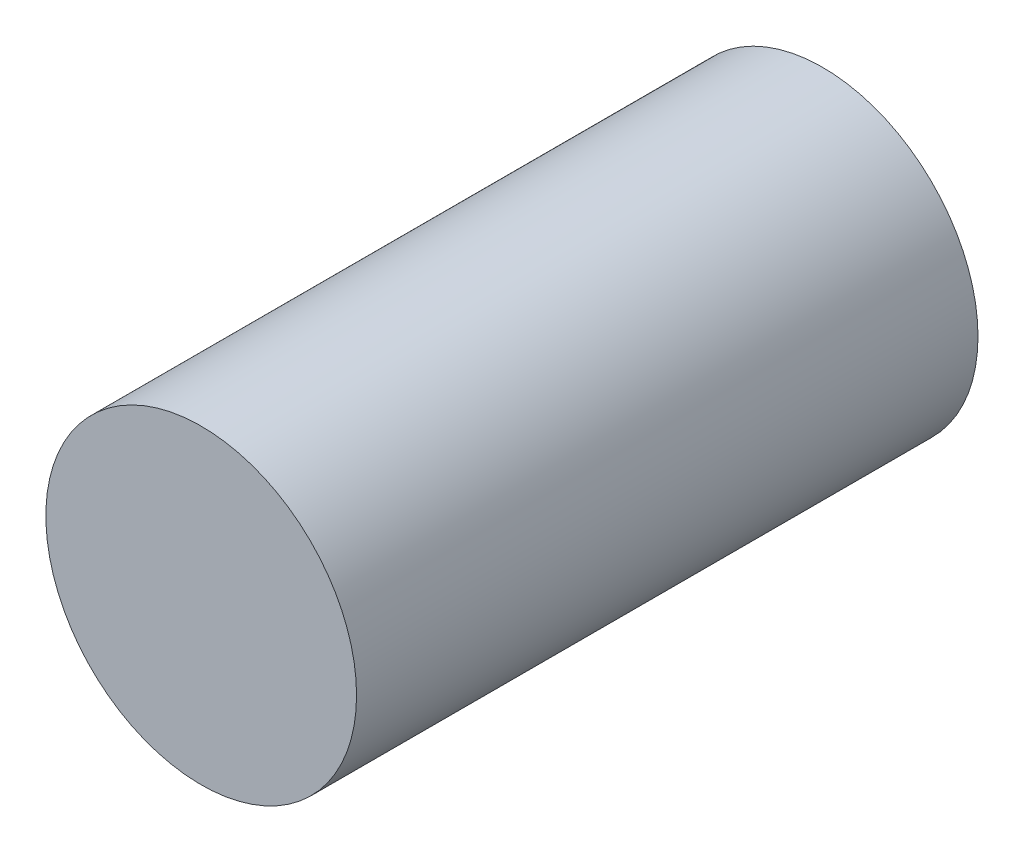
ISO-10303-21;
HEADER;
FILE_DESCRIPTION(('STEP AP214'),'2;1');
FILE_NAME('part.step','',(''),(''),'','','');
FILE_SCHEMA(('AUTOMOTIVE_DESIGN { 1 0 10303 214 1 1 1 1 }'));
ENDSEC;
DATA;
#1=APPLICATION_CONTEXT('core data for automotive mechanical design processes');
#2=APPLICATION_PROTOCOL_DEFINITION('international standard','automotive_design',2000,#1);
#3=PRODUCT_CONTEXT('',#1,'mechanical');
#4=PRODUCT('Part','Part','',(#3));
#5=PRODUCT_RELATED_PRODUCT_CATEGORY('part','',(#4));
#6=PRODUCT_DEFINITION_FORMATION('','',#4);
#7=PRODUCT_DEFINITION_CONTEXT('part definition',#1,'design');
#8=PRODUCT_DEFINITION('design','',#6,#7);
#9=PRODUCT_DEFINITION_SHAPE('','',#8);
#10=(LENGTH_UNIT() NAMED_UNIT(*) SI_UNIT(.MILLI.,.METRE.));
#11=(NAMED_UNIT(*) PLANE_ANGLE_UNIT() SI_UNIT($,.RADIAN.));
#12=(NAMED_UNIT(*) SI_UNIT($,.STERADIAN.) SOLID_ANGLE_UNIT());
#13=UNCERTAINTY_MEASURE_WITH_UNIT(LENGTH_MEASURE(1.E-05),#10,'distance_accuracy_value','');
#14=(GEOMETRIC_REPRESENTATION_CONTEXT(3) GLOBAL_UNCERTAINTY_ASSIGNED_CONTEXT((#13)) GLOBAL_UNIT_ASSIGNED_CONTEXT((#10,
#11,#12)) REPRESENTATION_CONTEXT('',''));
#15=CARTESIAN_POINT('',(0.,0.,0.));
#16=DIRECTION('',(0.,0.,1.));
#17=DIRECTION('',(1.,0.,0.));
#18=AXIS2_PLACEMENT_3D('',#15,#16,#17);
#19=CARTESIAN_POINT('',(0.,0.,100.));
#20=DIRECTION('',(0.,0.,-1.));
#21=DIRECTION('',(-1.,0.,0.));
#22=AXIS2_PLACEMENT_3D('',#19,#20,#21);
#23=CYLINDRICAL_SURFACE('',#22,25.);
#24=CARTESIAN_POINT('',(0.,0.,100.));
#25=DIRECTION('',(0.,0.,1.));
#26=DIRECTION('',(1.,0.,0.));
#27=AXIS2_PLACEMENT_3D('',#24,#25,#26);
#28=CIRCLE('',#27,25.);
#29=CARTESIAN_POINT('',(25.,0.,100.));
#30=VERTEX_POINT('',#29);
#31=EDGE_CURVE('E10',#30,#30,#28,.T.);
#32=ORIENTED_EDGE('',*,*,#31,.F.);
#33=EDGE_LOOP('',(#32));
#34=FACE_BOUND('',#33,.T.);
#35=CARTESIAN_POINT('',(0.,0.,0.));
#36=DIRECTION('',(0.,0.,1.));
#37=DIRECTION('',(1.,0.,0.));
#38=AXIS2_PLACEMENT_3D('',#35,#36,#37);
#39=CIRCLE('',#38,25.);
#40=CARTESIAN_POINT('',(25.,0.,0.));
#41=VERTEX_POINT('',#40);
#42=EDGE_CURVE('E42',#41,#41,#39,.T.);
#43=ORIENTED_EDGE('',*,*,#42,.T.);
#44=EDGE_LOOP('',(#43));
#45=FACE_BOUND('',#44,.T.);
#46=ADVANCED_FACE('F39',(#34,#45),#23,.T.);
#47=CARTESIAN_POINT('',(0.,0.,100.));
#48=DIRECTION('',(0.,0.,1.));
#49=DIRECTION('',(1.,0.,0.));
#50=AXIS2_PLACEMENT_3D('',#47,#48,#49);
#51=PLANE('',#50);
#52=ORIENTED_EDGE('',*,*,#31,.T.);
#53=EDGE_LOOP('',(#52));
#54=FACE_BOUND('',#53,.T.);
#55=ADVANCED_FACE('F54',(#54),#51,.T.);
#56=CARTESIAN_POINT('',(0.,0.,0.));
#57=DIRECTION('',(0.,0.,1.));
#58=DIRECTION('',(1.,0.,0.));
#59=AXIS2_PLACEMENT_3D('',#56,#57,#58);
#60=PLANE('',#59);
#61=ORIENTED_EDGE('',*,*,#42,.F.);
#62=EDGE_LOOP('',(#61));
#63=FACE_BOUND('',#62,.T.);
#64=ADVANCED_FACE('F52',(#63),#60,.F.);
#65=CLOSED_SHELL('',(#46,#55,#64));
#66=MANIFOLD_SOLID_BREP('B2',#65);
#67=ADVANCED_BREP_SHAPE_REPRESENTATION('',(#18,#66),#14);
#68=SHAPE_DEFINITION_REPRESENTATION(#9,#67);
ENDSEC;
END-ISO-10303-21;
